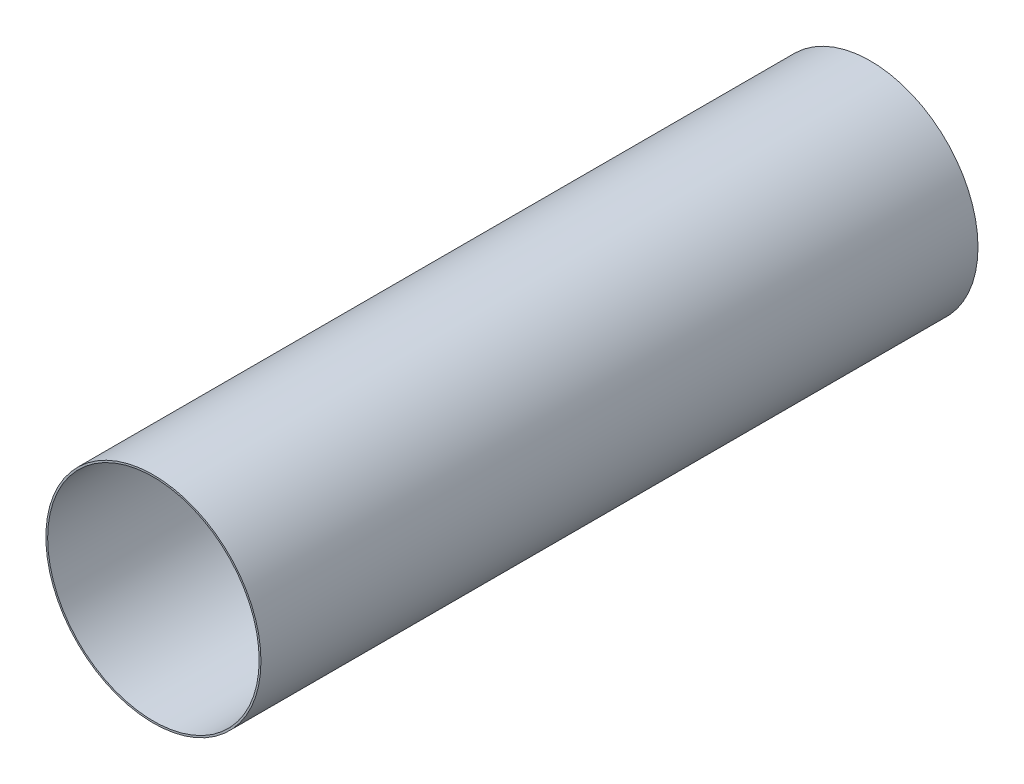
ISO-10303-21;
HEADER;
FILE_DESCRIPTION(('STEP AP214'),'2;1');
FILE_NAME('part.step','',(''),(''),'','','');
FILE_SCHEMA(('AUTOMOTIVE_DESIGN { 1 0 10303 214 1 1 1 1 }'));
ENDSEC;
DATA;
#1=APPLICATION_CONTEXT('core data for automotive mechanical design processes');
#2=APPLICATION_PROTOCOL_DEFINITION('international standard','automotive_design',2000,#1);
#3=PRODUCT_CONTEXT('',#1,'mechanical');
#4=PRODUCT('Part','Part','',(#3));
#5=PRODUCT_RELATED_PRODUCT_CATEGORY('part','',(#4));
#6=PRODUCT_DEFINITION_FORMATION('','',#4);
#7=PRODUCT_DEFINITION_CONTEXT('part definition',#1,'design');
#8=PRODUCT_DEFINITION('design','',#6,#7);
#9=PRODUCT_DEFINITION_SHAPE('','',#8);
#10=(LENGTH_UNIT() NAMED_UNIT(*) SI_UNIT(.MILLI.,.METRE.));
#11=(NAMED_UNIT(*) PLANE_ANGLE_UNIT() SI_UNIT($,.RADIAN.));
#12=(NAMED_UNIT(*) SI_UNIT($,.STERADIAN.) SOLID_ANGLE_UNIT());
#13=UNCERTAINTY_MEASURE_WITH_UNIT(LENGTH_MEASURE(1.E-05),#10,'distance_accuracy_value','');
#14=(GEOMETRIC_REPRESENTATION_CONTEXT(3) GLOBAL_UNCERTAINTY_ASSIGNED_CONTEXT((#13)) GLOBAL_UNIT_ASSIGNED_CONTEXT((#10,
#11,#12)) REPRESENTATION_CONTEXT('',''));
#15=CARTESIAN_POINT('',(0.,0.,0.));
#16=DIRECTION('',(0.,0.,1.));
#17=DIRECTION('',(1.,0.,0.));
#18=AXIS2_PLACEMENT_3D('',#15,#16,#17);
#19=CARTESIAN_POINT('',(0.,0.,200.));
#20=DIRECTION('',(0.,0.,1.));
#21=DIRECTION('',(1.,0.,0.));
#22=AXIS2_PLACEMENT_3D('',#19,#20,#21);
#23=PLANE('',#22);
#24=CARTESIAN_POINT('',(0.,0.,200.));
#25=DIRECTION('',(0.,0.,1.));
#26=DIRECTION('',(1.,0.,0.));
#27=AXIS2_PLACEMENT_3D('',#24,#25,#26);
#28=CIRCLE('',#27,30.);
#29=CARTESIAN_POINT('',(30.,0.,200.));
#30=VERTEX_POINT('',#29);
#31=EDGE_CURVE('E10',#30,#30,#28,.T.);
#32=ORIENTED_EDGE('',*,*,#31,.T.);
#33=EDGE_LOOP('',(#32));
#34=FACE_BOUND('',#33,.T.);
#35=CARTESIAN_POINT('',(0.,0.,200.));
#36=DIRECTION('',(0.,0.,1.));
#37=DIRECTION('',(1.,0.,0.));
#38=AXIS2_PLACEMENT_3D('',#35,#36,#37);
#39=CIRCLE('',#38,29.5);
#40=CARTESIAN_POINT('',(29.5,0.,200.));
#41=VERTEX_POINT('',#40);
#42=EDGE_CURVE('E57',#41,#41,#39,.T.);
#43=ORIENTED_EDGE('',*,*,#42,.F.);
#44=EDGE_LOOP('',(#43));
#45=FACE_BOUND('',#44,.T.);
#46=ADVANCED_FACE('F43',(#34,#45),#23,.T.);
#47=CARTESIAN_POINT('',(0.,0.,0.));
#48=DIRECTION('',(0.,0.,1.));
#49=DIRECTION('',(1.,0.,0.));
#50=AXIS2_PLACEMENT_3D('',#47,#48,#49);
#51=PLANE('',#50);
#52=CARTESIAN_POINT('',(0.,0.,0.));
#53=DIRECTION('',(0.,0.,1.));
#54=DIRECTION('',(1.,0.,0.));
#55=AXIS2_PLACEMENT_3D('',#52,#53,#54);
#56=CIRCLE('',#55,30.);
#57=CARTESIAN_POINT('',(30.,0.,0.));
#58=VERTEX_POINT('',#57);
#59=EDGE_CURVE('E48',#58,#58,#56,.T.);
#60=ORIENTED_EDGE('',*,*,#59,.F.);
#61=EDGE_LOOP('',(#60));
#62=FACE_BOUND('',#61,.T.);
#63=CARTESIAN_POINT('',(0.,0.,0.));
#64=DIRECTION('',(0.,0.,1.));
#65=DIRECTION('',(1.,0.,0.));
#66=AXIS2_PLACEMENT_3D('',#63,#64,#65);
#67=CIRCLE('',#66,29.5);
#68=CARTESIAN_POINT('',(29.5,0.,0.));
#69=VERTEX_POINT('',#68);
#70=EDGE_CURVE('E59',#69,#69,#67,.T.);
#71=ORIENTED_EDGE('',*,*,#70,.T.);
#72=EDGE_LOOP('',(#71));
#73=FACE_BOUND('',#72,.T.);
#74=ADVANCED_FACE('F71',(#62,#73),#51,.F.);
#75=CARTESIAN_POINT('',(0.,0.,200.));
#76=DIRECTION('',(0.,0.,-1.));
#77=DIRECTION('',(-1.,0.,0.));
#78=AXIS2_PLACEMENT_3D('',#75,#76,#77);
#79=CYLINDRICAL_SURFACE('',#78,30.);
#80=ORIENTED_EDGE('',*,*,#31,.F.);
#81=EDGE_LOOP('',(#80));
#82=FACE_BOUND('',#81,.T.);
#83=ORIENTED_EDGE('',*,*,#59,.T.);
#84=EDGE_LOOP('',(#83));
#85=FACE_BOUND('',#84,.T.);
#86=ADVANCED_FACE('F46',(#82,#85),#79,.T.);
#87=CARTESIAN_POINT('',(0.,0.,200.));
#88=DIRECTION('',(0.,0.,-1.));
#89=DIRECTION('',(-1.,0.,0.));
#90=AXIS2_PLACEMENT_3D('',#87,#88,#89);
#91=CYLINDRICAL_SURFACE('',#90,29.5);
#92=ORIENTED_EDGE('',*,*,#42,.T.);
#93=EDGE_LOOP('',(#92));
#94=FACE_BOUND('',#93,.T.);
#95=ORIENTED_EDGE('',*,*,#70,.F.);
#96=EDGE_LOOP('',(#95));
#97=FACE_BOUND('',#96,.T.);
#98=ADVANCED_FACE('F67',(#94,#97),#91,.F.);
#99=CLOSED_SHELL('',(#46,#74,#86,#98));
#100=MANIFOLD_SOLID_BREP('B2',#99);
#101=ADVANCED_BREP_SHAPE_REPRESENTATION('',(#18,#100),#14);
#102=SHAPE_DEFINITION_REPRESENTATION(#9,#101);
ENDSEC;
END-ISO-10303-21;
